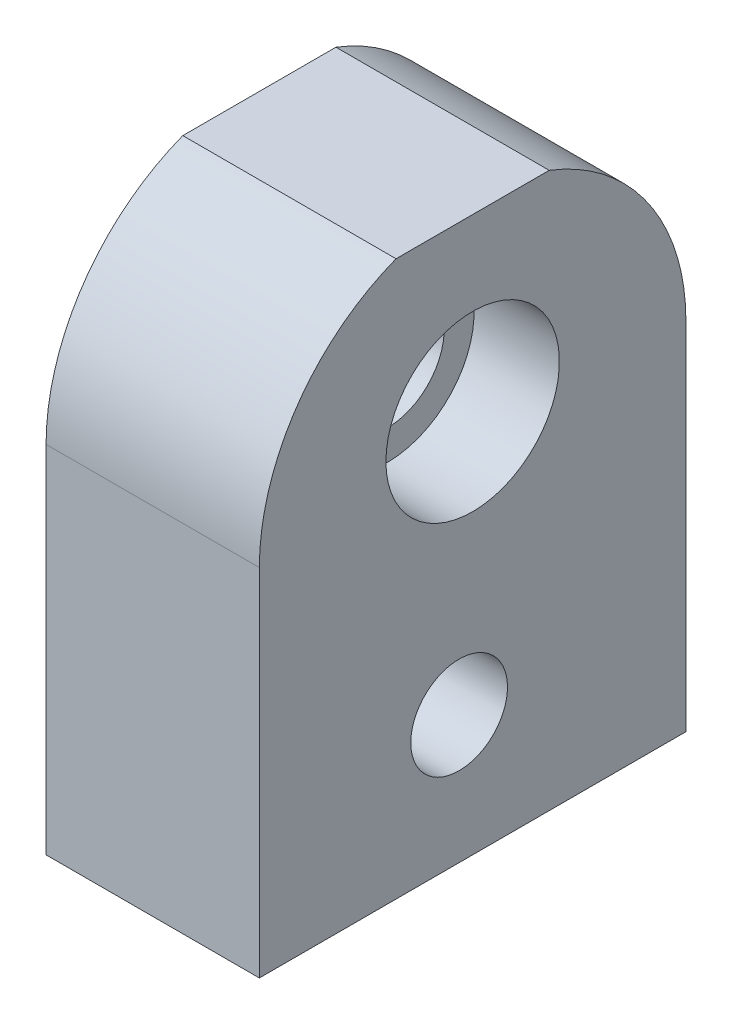
ISO-10303-21;
HEADER;
FILE_DESCRIPTION(('STEP AP214'),'2;1');
FILE_NAME('part.step','',(''),(''),'','','');
FILE_SCHEMA(('AUTOMOTIVE_DESIGN { 1 0 10303 214 1 1 1 1 }'));
ENDSEC;
DATA;
#1=APPLICATION_CONTEXT('core data for automotive mechanical design processes');
#2=APPLICATION_PROTOCOL_DEFINITION('international standard','automotive_design',2000,#1);
#3=PRODUCT_CONTEXT('',#1,'mechanical');
#4=PRODUCT('Part','Part','',(#3));
#5=PRODUCT_RELATED_PRODUCT_CATEGORY('part','',(#4));
#6=PRODUCT_DEFINITION_FORMATION('','',#4);
#7=PRODUCT_DEFINITION_CONTEXT('part definition',#1,'design');
#8=PRODUCT_DEFINITION('design','',#6,#7);
#9=PRODUCT_DEFINITION_SHAPE('','',#8);
#10=(LENGTH_UNIT() NAMED_UNIT(*) SI_UNIT(.MILLI.,.METRE.));
#11=(NAMED_UNIT(*) PLANE_ANGLE_UNIT() SI_UNIT($,.RADIAN.));
#12=(NAMED_UNIT(*) SI_UNIT($,.STERADIAN.) SOLID_ANGLE_UNIT());
#13=UNCERTAINTY_MEASURE_WITH_UNIT(LENGTH_MEASURE(1.E-05),#10,'distance_accuracy_value','');
#14=(GEOMETRIC_REPRESENTATION_CONTEXT(3) GLOBAL_UNCERTAINTY_ASSIGNED_CONTEXT((#13)) GLOBAL_UNIT_ASSIGNED_CONTEXT((#10,
#11,#12)) REPRESENTATION_CONTEXT('',''));
#15=CARTESIAN_POINT('',(0.,0.,0.));
#16=DIRECTION('',(0.,0.,1.));
#17=DIRECTION('',(1.,0.,0.));
#18=AXIS2_PLACEMENT_3D('',#15,#16,#17);
#19=CARTESIAN_POINT('',(-15.,25.,15.));
#20=DIRECTION('',(1.,0.,0.));
#21=DIRECTION('',(0.,0.,1.));
#22=AXIS2_PLACEMENT_3D('',#19,#20,#21);
#23=CYLINDRICAL_SURFACE('',#22,15.);
#24=DIRECTION('',(1.,0.,0.));
#25=VECTOR('',#24,1.);
#26=CARTESIAN_POINT('',(-15.,39.,9.6148351928655));
#27=LINE('',#26,#25);
#28=CARTESIAN_POINT('',(-15.,39.,9.6148351928655));
#29=VERTEX_POINT('',#28);
#30=CARTESIAN_POINT('',(0.,39.,9.6148351928655));
#31=VERTEX_POINT('',#30);
#32=EDGE_CURVE('E76',#29,#31,#27,.T.);
#33=ORIENTED_EDGE('',*,*,#32,.T.);
#34=CARTESIAN_POINT('',(0.,25.,15.));
#35=DIRECTION('',(-1.,0.,0.));
#36=DIRECTION('',(0.,0.,1.));
#37=AXIS2_PLACEMENT_3D('',#34,#35,#36);
#38=CIRCLE('',#37,15.);
#39=CARTESIAN_POINT('',(0.,25.,0.));
#40=VERTEX_POINT('',#39);
#41=EDGE_CURVE('E141',#31,#40,#38,.T.);
#42=ORIENTED_EDGE('',*,*,#41,.T.);
#43=DIRECTION('',(-1.,0.,0.));
#44=VECTOR('',#43,1.);
#45=CARTESIAN_POINT('',(0.,25.,0.));
#46=LINE('',#45,#44);
#47=CARTESIAN_POINT('',(-15.,25.,0.));
#48=VERTEX_POINT('',#47);
#49=EDGE_CURVE('E126',#40,#48,#46,.T.);
#50=ORIENTED_EDGE('',*,*,#49,.T.);
#51=CARTESIAN_POINT('',(-15.,25.,15.));
#52=DIRECTION('',(-1.,0.,0.));
#53=DIRECTION('',(0.,0.,1.));
#54=AXIS2_PLACEMENT_3D('',#51,#52,#53);
#55=CIRCLE('',#54,15.);
#56=EDGE_CURVE('E115',#29,#48,#55,.T.);
#57=ORIENTED_EDGE('',*,*,#56,.F.);
#58=EDGE_LOOP('',(#33,#42,#50,#57));
#59=FACE_BOUND('',#58,.T.);
#60=ADVANCED_FACE('F41',(#59),#23,.T.);
#61=CARTESIAN_POINT('',(-15.,25.,0.));
#62=DIRECTION('',(-1.,0.,0.));
#63=DIRECTION('',(0.,0.,-1.));
#64=AXIS2_PLACEMENT_3D('',#61,#62,#63);
#65=PLANE('',#64);
#66=CARTESIAN_POINT('',(-15.,9.,15.95));
#67=DIRECTION('',(-1.,0.,0.));
#68=DIRECTION('',(0.,0.,1.));
#69=AXIS2_PLACEMENT_3D('',#66,#67,#68);
#70=CIRCLE('',#69,3.4);
#71=CARTESIAN_POINT('',(-15.,9.,19.35));
#72=VERTEX_POINT('',#71);
#73=EDGE_CURVE('E170',#72,#72,#70,.T.);
#74=ORIENTED_EDGE('',*,*,#73,.F.);
#75=EDGE_LOOP('',(#74));
#76=FACE_BOUND('',#75,.T.);
#77=DIRECTION('',(0.,0.,-1.));
#78=VECTOR('',#77,1.);
#79=CARTESIAN_POINT('',(-15.,39.,0.));
#80=LINE('',#79,#78);
#81=CARTESIAN_POINT('',(-15.,39.,20.3851648071345));
#82=VERTEX_POINT('',#81);
#83=EDGE_CURVE('E60',#82,#29,#80,.T.);
#84=ORIENTED_EDGE('',*,*,#83,.T.);
#85=ORIENTED_EDGE('',*,*,#56,.T.);
#86=DIRECTION('',(0.,-1.,0.));
#87=VECTOR('',#86,1.);
#88=CARTESIAN_POINT('',(-15.,25.,0.));
#89=LINE('',#88,#87);
#90=CARTESIAN_POINT('',(-15.,0.,0.));
#91=VERTEX_POINT('',#90);
#92=EDGE_CURVE('E11',#48,#91,#89,.T.);
#93=ORIENTED_EDGE('',*,*,#92,.T.);
#94=DIRECTION('',(0.,0.,1.));
#95=VECTOR('',#94,1.);
#96=CARTESIAN_POINT('',(-15.,0.,0.));
#97=LINE('',#96,#95);
#98=CARTESIAN_POINT('',(-15.,0.,30.));
#99=VERTEX_POINT('',#98);
#100=EDGE_CURVE('E113',#91,#99,#97,.T.);
#101=ORIENTED_EDGE('',*,*,#100,.T.);
#102=DIRECTION('',(0.,-1.,0.));
#103=VECTOR('',#102,1.);
#104=CARTESIAN_POINT('',(-15.,25.,30.));
#105=LINE('',#104,#103);
#106=CARTESIAN_POINT('',(-15.,25.,30.));
#107=VERTEX_POINT('',#106);
#108=EDGE_CURVE('E132',#107,#99,#105,.T.);
#109=ORIENTED_EDGE('',*,*,#108,.F.);
#110=EDGE_CURVE('E120',#107,#82,#55,.T.);
#111=ORIENTED_EDGE('',*,*,#110,.T.);
#112=EDGE_LOOP('',(#84,#85,#93,#101,#109,#111));
#113=FACE_BOUND('',#112,.T.);
#114=CARTESIAN_POINT('',(-15.,27.,15.));
#115=DIRECTION('',(-1.,0.,0.));
#116=DIRECTION('',(0.,0.,1.));
#117=AXIS2_PLACEMENT_3D('',#114,#115,#116);
#118=CIRCLE('',#117,4.);
#119=CARTESIAN_POINT('',(-15.,27.,19.));
#120=VERTEX_POINT('',#119);
#121=EDGE_CURVE('E159',#120,#120,#118,.T.);
#122=ORIENTED_EDGE('',*,*,#121,.F.);
#123=EDGE_LOOP('',(#122));
#124=FACE_BOUND('',#123,.T.);
#125=ADVANCED_FACE('F43',(#76,#113,#124),#65,.T.);
#126=CARTESIAN_POINT('',(0.,25.,0.));
#127=DIRECTION('',(0.,0.,-1.));
#128=DIRECTION('',(1.,0.,0.));
#129=AXIS2_PLACEMENT_3D('',#126,#127,#128);
#130=PLANE('',#129);
#131=DIRECTION('',(-1.,0.,0.));
#132=VECTOR('',#131,1.);
#133=CARTESIAN_POINT('',(0.,0.,0.));
#134=LINE('',#133,#132);
#135=CARTESIAN_POINT('',(0.,0.,0.));
#136=VERTEX_POINT('',#135);
#137=EDGE_CURVE('E102',#136,#91,#134,.T.);
#138=ORIENTED_EDGE('',*,*,#137,.T.);
#139=ORIENTED_EDGE('',*,*,#92,.F.);
#140=ORIENTED_EDGE('',*,*,#49,.F.);
#141=DIRECTION('',(0.,-1.,0.));
#142=VECTOR('',#141,1.);
#143=CARTESIAN_POINT('',(0.,25.,0.));
#144=LINE('',#143,#142);
#145=EDGE_CURVE('E51',#40,#136,#144,.T.);
#146=ORIENTED_EDGE('',*,*,#145,.T.);
#147=EDGE_LOOP('',(#138,#139,#140,#146));
#148=FACE_BOUND('',#147,.T.);
#149=ADVANCED_FACE('F103',(#148),#130,.T.);
#150=CARTESIAN_POINT('',(0.,25.,0.));
#151=DIRECTION('',(-1.,0.,0.));
#152=DIRECTION('',(0.,0.,-1.));
#153=AXIS2_PLACEMENT_3D('',#150,#151,#152);
#154=PLANE('',#153);
#155=CARTESIAN_POINT('',(0.,9.,15.95));
#156=DIRECTION('',(-1.,0.,0.));
#157=DIRECTION('',(0.,0.,1.));
#158=AXIS2_PLACEMENT_3D('',#155,#156,#157);
#159=CIRCLE('',#158,3.4);
#160=CARTESIAN_POINT('',(0.,9.,19.35));
#161=VERTEX_POINT('',#160);
#162=EDGE_CURVE('E171',#161,#161,#159,.T.);
#163=ORIENTED_EDGE('',*,*,#162,.T.);
#164=EDGE_LOOP('',(#163));
#165=FACE_BOUND('',#164,.T.);
#166=CARTESIAN_POINT('',(0.,27.,15.));
#167=DIRECTION('',(-1.,0.,0.));
#168=DIRECTION('',(0.,0.,1.));
#169=AXIS2_PLACEMENT_3D('',#166,#167,#168);
#170=CIRCLE('',#169,6.1);
#171=CARTESIAN_POINT('',(0.,27.,21.1));
#172=VERTEX_POINT('',#171);
#173=EDGE_CURVE('E156',#172,#172,#170,.T.);
#174=ORIENTED_EDGE('',*,*,#173,.T.);
#175=EDGE_LOOP('',(#174));
#176=FACE_BOUND('',#175,.T.);
#177=ORIENTED_EDGE('',*,*,#41,.F.);
#178=DIRECTION('',(0.,0.,-1.));
#179=VECTOR('',#178,1.);
#180=CARTESIAN_POINT('',(0.,39.,0.));
#181=LINE('',#180,#179);
#182=CARTESIAN_POINT('',(0.,39.,20.3851648071345));
#183=VERTEX_POINT('',#182);
#184=EDGE_CURVE('E45',#183,#31,#181,.T.);
#185=ORIENTED_EDGE('',*,*,#184,.F.);
#186=CARTESIAN_POINT('',(0.,25.,30.));
#187=VERTEX_POINT('',#186);
#188=EDGE_CURVE('E140',#187,#183,#38,.T.);
#189=ORIENTED_EDGE('',*,*,#188,.F.);
#190=DIRECTION('',(0.,-1.,0.));
#191=VECTOR('',#190,1.);
#192=CARTESIAN_POINT('',(0.,25.,30.));
#193=LINE('',#192,#191);
#194=CARTESIAN_POINT('',(0.,0.,30.));
#195=VERTEX_POINT('',#194);
#196=EDGE_CURVE('E131',#187,#195,#193,.T.);
#197=ORIENTED_EDGE('',*,*,#196,.T.);
#198=DIRECTION('',(0.,0.,1.));
#199=VECTOR('',#198,1.);
#200=CARTESIAN_POINT('',(0.,0.,0.));
#201=LINE('',#200,#199);
#202=EDGE_CURVE('E96',#136,#195,#201,.T.);
#203=ORIENTED_EDGE('',*,*,#202,.F.);
#204=ORIENTED_EDGE('',*,*,#145,.F.);
#205=EDGE_LOOP('',(#177,#185,#189,#197,#203,#204));
#206=FACE_BOUND('',#205,.T.);
#207=ADVANCED_FACE('F186',(#165,#176,#206),#154,.F.);
#208=CARTESIAN_POINT('',(-15.,25.,30.));
#209=DIRECTION('',(0.,0.,1.));
#210=DIRECTION('',(-1.,0.,0.));
#211=AXIS2_PLACEMENT_3D('',#208,#209,#210);
#212=PLANE('',#211);
#213=DIRECTION('',(1.,0.,0.));
#214=VECTOR('',#213,1.);
#215=CARTESIAN_POINT('',(-15.,0.,30.));
#216=LINE('',#215,#214);
#217=EDGE_CURVE('E118',#99,#195,#216,.T.);
#218=ORIENTED_EDGE('',*,*,#217,.T.);
#219=ORIENTED_EDGE('',*,*,#196,.F.);
#220=DIRECTION('',(1.,0.,0.));
#221=VECTOR('',#220,1.);
#222=CARTESIAN_POINT('',(-15.,25.,30.));
#223=LINE('',#222,#221);
#224=EDGE_CURVE('E107',#107,#187,#223,.T.);
#225=ORIENTED_EDGE('',*,*,#224,.F.);
#226=ORIENTED_EDGE('',*,*,#108,.T.);
#227=EDGE_LOOP('',(#218,#219,#225,#226));
#228=FACE_BOUND('',#227,.T.);
#229=ADVANCED_FACE('F204',(#228),#212,.T.);
#230=CARTESIAN_POINT('',(0.,0.,0.));
#231=DIRECTION('',(0.,-1.,0.));
#232=DIRECTION('',(0.,0.,-1.));
#233=AXIS2_PLACEMENT_3D('',#230,#231,#232);
#234=PLANE('',#233);
#235=CARTESIAN_POINT('',(-7.5,0.,24.));
#236=DIRECTION('',(0.,1.,0.));
#237=DIRECTION('',(0.,0.,-1.));
#238=AXIS2_PLACEMENT_3D('',#235,#236,#237);
#239=CIRCLE('',#238,1.65);
#240=CARTESIAN_POINT('',(-7.5,0.,22.35));
#241=VERTEX_POINT('',#240);
#242=EDGE_CURVE('E150',#241,#241,#239,.T.);
#243=ORIENTED_EDGE('',*,*,#242,.T.);
#244=EDGE_LOOP('',(#243));
#245=FACE_BOUND('',#244,.T.);
#246=CARTESIAN_POINT('',(-7.50000000000001,0.,6.));
#247=DIRECTION('',(0.,1.,0.));
#248=DIRECTION('',(0.,0.,-1.));
#249=AXIS2_PLACEMENT_3D('',#246,#247,#248);
#250=CIRCLE('',#249,1.65);
#251=CARTESIAN_POINT('',(-7.50000000000001,0.,4.35));
#252=VERTEX_POINT('',#251);
#253=EDGE_CURVE('E143',#252,#252,#250,.T.);
#254=ORIENTED_EDGE('',*,*,#253,.T.);
#255=EDGE_LOOP('',(#254));
#256=FACE_BOUND('',#255,.T.);
#257=ORIENTED_EDGE('',*,*,#100,.F.);
#258=ORIENTED_EDGE('',*,*,#137,.F.);
#259=ORIENTED_EDGE('',*,*,#202,.T.);
#260=ORIENTED_EDGE('',*,*,#217,.F.);
#261=EDGE_LOOP('',(#257,#258,#259,#260));
#262=FACE_BOUND('',#261,.T.);
#263=ADVANCED_FACE('F117',(#245,#256,#262),#234,.T.);
#264=DIRECTION('',(1.,0.,0.));
#265=VECTOR('',#264,1.);
#266=CARTESIAN_POINT('',(-15.,39.,20.3851648071345));
#267=LINE('',#266,#265);
#268=EDGE_CURVE('E71',#82,#183,#267,.T.);
#269=ORIENTED_EDGE('',*,*,#268,.F.);
#270=ORIENTED_EDGE('',*,*,#110,.F.);
#271=ORIENTED_EDGE('',*,*,#224,.T.);
#272=ORIENTED_EDGE('',*,*,#188,.T.);
#273=EDGE_LOOP('',(#269,#270,#271,#272));
#274=FACE_BOUND('',#273,.T.);
#275=ADVANCED_FACE('F190',(#274),#23,.T.);
#276=CARTESIAN_POINT('',(-7.50000000000001,10.,6.));
#277=DIRECTION('',(0.,-1.,0.));
#278=DIRECTION('',(0.,0.,-1.));
#279=AXIS2_PLACEMENT_3D('',#276,#277,#278);
#280=CYLINDRICAL_SURFACE('',#279,1.65);
#281=CARTESIAN_POINT('',(-7.50000000000001,10.,6.));
#282=DIRECTION('',(0.,1.,0.));
#283=DIRECTION('',(0.,0.,-1.));
#284=AXIS2_PLACEMENT_3D('',#281,#282,#283);
#285=CIRCLE('',#284,1.65);
#286=CARTESIAN_POINT('',(-7.50000000000001,10.,4.35));
#287=VERTEX_POINT('',#286);
#288=EDGE_CURVE('E146',#287,#287,#285,.T.);
#289=ORIENTED_EDGE('',*,*,#288,.T.);
#290=EDGE_LOOP('',(#289));
#291=FACE_BOUND('',#290,.T.);
#292=ORIENTED_EDGE('',*,*,#253,.F.);
#293=EDGE_LOOP('',(#292));
#294=FACE_BOUND('',#293,.T.);
#295=ADVANCED_FACE('F197',(#291,#294),#280,.F.);
#296=CARTESIAN_POINT('',(0.,10.,0.));
#297=DIRECTION('',(0.,-1.,0.));
#298=DIRECTION('',(0.,0.,-1.));
#299=AXIS2_PLACEMENT_3D('',#296,#297,#298);
#300=PLANE('',#299);
#301=ORIENTED_EDGE('',*,*,#288,.F.);
#302=EDGE_LOOP('',(#301));
#303=FACE_BOUND('',#302,.T.);
#304=ADVANCED_FACE('F201',(#303),#300,.T.);
#305=CARTESIAN_POINT('',(-7.5,10.,24.));
#306=DIRECTION('',(0.,-1.,0.));
#307=DIRECTION('',(0.,0.,-1.));
#308=AXIS2_PLACEMENT_3D('',#305,#306,#307);
#309=CYLINDRICAL_SURFACE('',#308,1.65);
#310=CARTESIAN_POINT('',(-7.5,10.,24.));
#311=DIRECTION('',(0.,1.,0.));
#312=DIRECTION('',(0.,0.,-1.));
#313=AXIS2_PLACEMENT_3D('',#310,#311,#312);
#314=CIRCLE('',#313,1.65);
#315=CARTESIAN_POINT('',(-7.5,10.,22.35));
#316=VERTEX_POINT('',#315);
#317=EDGE_CURVE('E153',#316,#316,#314,.T.);
#318=ORIENTED_EDGE('',*,*,#317,.T.);
#319=EDGE_LOOP('',(#318));
#320=FACE_BOUND('',#319,.T.);
#321=ORIENTED_EDGE('',*,*,#242,.F.);
#322=EDGE_LOOP('',(#321));
#323=FACE_BOUND('',#322,.T.);
#324=ADVANCED_FACE('F229',(#320,#323),#309,.F.);
#325=CARTESIAN_POINT('',(0.,10.,0.));
#326=DIRECTION('',(0.,-1.,0.));
#327=DIRECTION('',(0.,0.,-1.));
#328=AXIS2_PLACEMENT_3D('',#325,#326,#327);
#329=PLANE('',#328);
#330=ORIENTED_EDGE('',*,*,#317,.F.);
#331=EDGE_LOOP('',(#330));
#332=FACE_BOUND('',#331,.T.);
#333=ADVANCED_FACE('F225',(#332),#329,.T.);
#334=CARTESIAN_POINT('',(-6.,27.,15.));
#335=DIRECTION('',(1.,0.,0.));
#336=DIRECTION('',(0.,0.,1.));
#337=AXIS2_PLACEMENT_3D('',#334,#335,#336);
#338=CYLINDRICAL_SURFACE('',#337,6.1);
#339=CARTESIAN_POINT('',(-6.,27.,15.));
#340=DIRECTION('',(-1.,0.,0.));
#341=DIRECTION('',(0.,0.,1.));
#342=AXIS2_PLACEMENT_3D('',#339,#340,#341);
#343=CIRCLE('',#342,6.1);
#344=CARTESIAN_POINT('',(-6.,27.,21.1));
#345=VERTEX_POINT('',#344);
#346=EDGE_CURVE('E147',#345,#345,#343,.T.);
#347=ORIENTED_EDGE('',*,*,#346,.T.);
#348=EDGE_LOOP('',(#347));
#349=FACE_BOUND('',#348,.T.);
#350=ORIENTED_EDGE('',*,*,#173,.F.);
#351=EDGE_LOOP('',(#350));
#352=FACE_BOUND('',#351,.T.);
#353=ADVANCED_FACE('F221',(#349,#352),#338,.F.);
#354=CARTESIAN_POINT('',(-6.,27.,15.));
#355=DIRECTION('',(1.,0.,0.));
#356=DIRECTION('',(0.,0.,1.));
#357=AXIS2_PLACEMENT_3D('',#354,#355,#356);
#358=PLANE('',#357);
#359=CARTESIAN_POINT('',(-6.,27.,15.));
#360=DIRECTION('',(-1.,0.,0.));
#361=DIRECTION('',(0.,0.,1.));
#362=AXIS2_PLACEMENT_3D('',#359,#360,#361);
#363=CIRCLE('',#362,4.);
#364=CARTESIAN_POINT('',(-6.,27.,19.));
#365=VERTEX_POINT('',#364);
#366=EDGE_CURVE('E162',#365,#365,#363,.T.);
#367=ORIENTED_EDGE('',*,*,#366,.T.);
#368=EDGE_LOOP('',(#367));
#369=FACE_BOUND('',#368,.T.);
#370=ORIENTED_EDGE('',*,*,#346,.F.);
#371=EDGE_LOOP('',(#370));
#372=FACE_BOUND('',#371,.T.);
#373=ADVANCED_FACE('F215',(#369,#372),#358,.T.);
#374=CARTESIAN_POINT('',(-15.,27.,15.));
#375=DIRECTION('',(1.,0.,0.));
#376=DIRECTION('',(0.,0.,1.));
#377=AXIS2_PLACEMENT_3D('',#374,#375,#376);
#378=CYLINDRICAL_SURFACE('',#377,4.);
#379=ORIENTED_EDGE('',*,*,#121,.T.);
#380=EDGE_LOOP('',(#379));
#381=FACE_BOUND('',#380,.T.);
#382=ORIENTED_EDGE('',*,*,#366,.F.);
#383=EDGE_LOOP('',(#382));
#384=FACE_BOUND('',#383,.T.);
#385=ADVANCED_FACE('F209',(#381,#384),#378,.F.);
#386=CARTESIAN_POINT('',(-15.,39.,0.));
#387=DIRECTION('',(0.,-1.,0.));
#388=DIRECTION('',(0.,0.,-1.));
#389=AXIS2_PLACEMENT_3D('',#386,#387,#388);
#390=PLANE('',#389);
#391=ORIENTED_EDGE('',*,*,#32,.F.);
#392=ORIENTED_EDGE('',*,*,#83,.F.);
#393=ORIENTED_EDGE('',*,*,#268,.T.);
#394=ORIENTED_EDGE('',*,*,#184,.T.);
#395=EDGE_LOOP('',(#391,#392,#393,#394));
#396=FACE_BOUND('',#395,.T.);
#397=ADVANCED_FACE('F208',(#396),#390,.F.);
#398=CARTESIAN_POINT('',(-15.,9.,15.95));
#399=DIRECTION('',(1.,0.,0.));
#400=DIRECTION('',(0.,0.,-1.));
#401=AXIS2_PLACEMENT_3D('',#398,#399,#400);
#402=CYLINDRICAL_SURFACE('',#401,3.4);
#403=ORIENTED_EDGE('',*,*,#73,.T.);
#404=EDGE_LOOP('',(#403));
#405=FACE_BOUND('',#404,.T.);
#406=ORIENTED_EDGE('',*,*,#162,.F.);
#407=EDGE_LOOP('',(#406));
#408=FACE_BOUND('',#407,.T.);
#409=ADVANCED_FACE('F177',(#405,#408),#402,.F.);
#410=CLOSED_SHELL('',(#60,#125,#149,#207,#229,#263,#275,#295,#304,#324,#333,#353,#373,#385,#397,#409));
#411=MANIFOLD_SOLID_BREP('B2',#410);
#412=ADVANCED_BREP_SHAPE_REPRESENTATION('',(#18,#411),#14);
#413=SHAPE_DEFINITION_REPRESENTATION(#9,#412);
ENDSEC;
END-ISO-10303-21;
